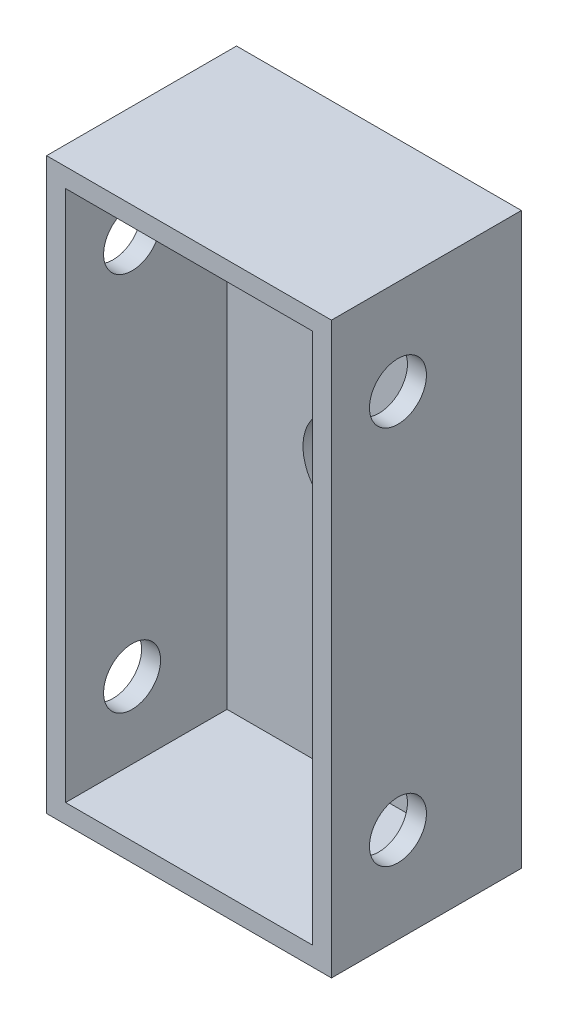
ISO-10303-21;
HEADER;
FILE_DESCRIPTION(('STEP AP214'),'2;1');
FILE_NAME('part.step','',(''),(''),'','','');
FILE_SCHEMA(('AUTOMOTIVE_DESIGN { 1 0 10303 214 1 1 1 1 }'));
ENDSEC;
DATA;
#1=APPLICATION_CONTEXT('core data for automotive mechanical design processes');
#2=APPLICATION_PROTOCOL_DEFINITION('international standard','automotive_design',2000,#1);
#3=PRODUCT_CONTEXT('',#1,'mechanical');
#4=PRODUCT('Part','Part','',(#3));
#5=PRODUCT_RELATED_PRODUCT_CATEGORY('part','',(#4));
#6=PRODUCT_DEFINITION_FORMATION('','',#4);
#7=PRODUCT_DEFINITION_CONTEXT('part definition',#1,'design');
#8=PRODUCT_DEFINITION('design','',#6,#7);
#9=PRODUCT_DEFINITION_SHAPE('','',#8);
#10=(LENGTH_UNIT() NAMED_UNIT(*) SI_UNIT(.MILLI.,.METRE.));
#11=(NAMED_UNIT(*) PLANE_ANGLE_UNIT() SI_UNIT($,.RADIAN.));
#12=(NAMED_UNIT(*) SI_UNIT($,.STERADIAN.) SOLID_ANGLE_UNIT());
#13=UNCERTAINTY_MEASURE_WITH_UNIT(LENGTH_MEASURE(1.E-05),#10,'distance_accuracy_value','');
#14=(GEOMETRIC_REPRESENTATION_CONTEXT(3) GLOBAL_UNCERTAINTY_ASSIGNED_CONTEXT((#13)) GLOBAL_UNIT_ASSIGNED_CONTEXT((#10,
#11,#12)) REPRESENTATION_CONTEXT('',''));
#15=CARTESIAN_POINT('',(0.,0.,0.));
#16=DIRECTION('',(0.,0.,1.));
#17=DIRECTION('',(1.,0.,0.));
#18=AXIS2_PLACEMENT_3D('',#15,#16,#17);
#19=CARTESIAN_POINT('',(0.,0.,20.));
#20=DIRECTION('',(1.,0.,0.));
#21=DIRECTION('',(0.,0.,-1.));
#22=AXIS2_PLACEMENT_3D('',#19,#20,#21);
#23=PLANE('',#22);
#24=CARTESIAN_POINT('',(0.,50.,13.));
#25=DIRECTION('',(1.,0.,0.));
#26=DIRECTION('',(0.,0.,-1.));
#27=AXIS2_PLACEMENT_3D('',#24,#25,#26);
#28=CIRCLE('',#27,3.);
#29=CARTESIAN_POINT('',(0.,50.,10.));
#30=VERTEX_POINT('',#29);
#31=EDGE_CURVE('E174',#30,#30,#28,.T.);
#32=ORIENTED_EDGE('',*,*,#31,.T.);
#33=EDGE_LOOP('',(#32));
#34=FACE_BOUND('',#33,.T.);
#35=CARTESIAN_POINT('',(0.,10.,13.));
#36=DIRECTION('',(1.,0.,0.));
#37=DIRECTION('',(0.,0.,-1.));
#38=AXIS2_PLACEMENT_3D('',#35,#36,#37);
#39=CIRCLE('',#38,3.);
#40=CARTESIAN_POINT('',(0.,10.,10.));
#41=VERTEX_POINT('',#40);
#42=EDGE_CURVE('E185',#41,#41,#39,.T.);
#43=ORIENTED_EDGE('',*,*,#42,.T.);
#44=EDGE_LOOP('',(#43));
#45=FACE_BOUND('',#44,.T.);
#46=DIRECTION('',(0.,-1.,0.));
#47=VECTOR('',#46,1.);
#48=CARTESIAN_POINT('',(0.,0.,0.));
#49=LINE('',#48,#47);
#50=CARTESIAN_POINT('',(0.,60.,0.));
#51=VERTEX_POINT('',#50);
#52=CARTESIAN_POINT('',(0.,0.,0.));
#53=VERTEX_POINT('',#52);
#54=EDGE_CURVE('E147',#51,#53,#49,.T.);
#55=ORIENTED_EDGE('',*,*,#54,.T.);
#56=DIRECTION('',(0.,0.,-1.));
#57=VECTOR('',#56,1.);
#58=CARTESIAN_POINT('',(0.,0.,20.));
#59=LINE('',#58,#57);
#60=CARTESIAN_POINT('',(0.,0.,20.));
#61=VERTEX_POINT('',#60);
#62=EDGE_CURVE('E11',#61,#53,#59,.T.);
#63=ORIENTED_EDGE('',*,*,#62,.F.);
#64=DIRECTION('',(0.,-1.,0.));
#65=VECTOR('',#64,1.);
#66=CARTESIAN_POINT('',(0.,0.,20.));
#67=LINE('',#66,#65);
#68=CARTESIAN_POINT('',(0.,60.,20.));
#69=VERTEX_POINT('',#68);
#70=EDGE_CURVE('E151',#69,#61,#67,.T.);
#71=ORIENTED_EDGE('',*,*,#70,.F.);
#72=DIRECTION('',(0.,0.,-1.));
#73=VECTOR('',#72,1.);
#74=CARTESIAN_POINT('',(0.,60.,20.));
#75=LINE('',#74,#73);
#76=EDGE_CURVE('E157',#69,#51,#75,.T.);
#77=ORIENTED_EDGE('',*,*,#76,.T.);
#78=EDGE_LOOP('',(#55,#63,#71,#77));
#79=FACE_BOUND('',#78,.T.);
#80=ADVANCED_FACE('F34',(#34,#45,#79),#23,.F.);
#81=CARTESIAN_POINT('',(0.,0.,20.));
#82=DIRECTION('',(0.,1.,0.));
#83=DIRECTION('',(0.,0.,1.));
#84=AXIS2_PLACEMENT_3D('',#81,#82,#83);
#85=PLANE('',#84);
#86=DIRECTION('',(1.,0.,0.));
#87=VECTOR('',#86,1.);
#88=CARTESIAN_POINT('',(0.,0.,0.));
#89=LINE('',#88,#87);
#90=CARTESIAN_POINT('',(30.,0.,0.));
#91=VERTEX_POINT('',#90);
#92=EDGE_CURVE('E160',#53,#91,#89,.T.);
#93=ORIENTED_EDGE('',*,*,#92,.T.);
#94=DIRECTION('',(0.,0.,-1.));
#95=VECTOR('',#94,1.);
#96=CARTESIAN_POINT('',(30.,0.,20.));
#97=LINE('',#96,#95);
#98=CARTESIAN_POINT('',(30.,0.,20.));
#99=VERTEX_POINT('',#98);
#100=EDGE_CURVE('E42',#99,#91,#97,.T.);
#101=ORIENTED_EDGE('',*,*,#100,.F.);
#102=DIRECTION('',(1.,0.,0.));
#103=VECTOR('',#102,1.);
#104=CARTESIAN_POINT('',(0.,0.,20.));
#105=LINE('',#104,#103);
#106=EDGE_CURVE('E87',#61,#99,#105,.T.);
#107=ORIENTED_EDGE('',*,*,#106,.F.);
#108=ORIENTED_EDGE('',*,*,#62,.T.);
#109=EDGE_LOOP('',(#93,#101,#107,#108));
#110=FACE_BOUND('',#109,.T.);
#111=ADVANCED_FACE('F232',(#110),#85,.F.);
#112=CARTESIAN_POINT('',(30.,0.,20.));
#113=DIRECTION('',(-1.,0.,0.));
#114=DIRECTION('',(0.,0.,1.));
#115=AXIS2_PLACEMENT_3D('',#112,#113,#114);
#116=PLANE('',#115);
#117=CARTESIAN_POINT('',(30.,50.,13.));
#118=DIRECTION('',(1.,0.,0.));
#119=DIRECTION('',(0.,0.,-1.));
#120=AXIS2_PLACEMENT_3D('',#117,#118,#119);
#121=CIRCLE('',#120,3.);
#122=CARTESIAN_POINT('',(30.,50.,10.));
#123=VERTEX_POINT('',#122);
#124=EDGE_CURVE('E180',#123,#123,#121,.T.);
#125=ORIENTED_EDGE('',*,*,#124,.F.);
#126=EDGE_LOOP('',(#125));
#127=FACE_BOUND('',#126,.T.);
#128=CARTESIAN_POINT('',(30.,10.,13.));
#129=DIRECTION('',(1.,0.,0.));
#130=DIRECTION('',(0.,0.,-1.));
#131=AXIS2_PLACEMENT_3D('',#128,#129,#130);
#132=CIRCLE('',#131,3.);
#133=CARTESIAN_POINT('',(30.,10.,10.));
#134=VERTEX_POINT('',#133);
#135=EDGE_CURVE('E190',#134,#134,#132,.T.);
#136=ORIENTED_EDGE('',*,*,#135,.F.);
#137=EDGE_LOOP('',(#136));
#138=FACE_BOUND('',#137,.T.);
#139=DIRECTION('',(0.,1.,0.));
#140=VECTOR('',#139,1.);
#141=CARTESIAN_POINT('',(30.,0.,0.));
#142=LINE('',#141,#140);
#143=CARTESIAN_POINT('',(30.,60.,0.));
#144=VERTEX_POINT('',#143);
#145=EDGE_CURVE('E162',#91,#144,#142,.T.);
#146=ORIENTED_EDGE('',*,*,#145,.T.);
#147=DIRECTION('',(0.,0.,-1.));
#148=VECTOR('',#147,1.);
#149=CARTESIAN_POINT('',(30.,60.,20.));
#150=LINE('',#149,#148);
#151=CARTESIAN_POINT('',(30.,60.,20.));
#152=VERTEX_POINT('',#151);
#153=EDGE_CURVE('E166',#152,#144,#150,.T.);
#154=ORIENTED_EDGE('',*,*,#153,.F.);
#155=DIRECTION('',(0.,1.,0.));
#156=VECTOR('',#155,1.);
#157=CARTESIAN_POINT('',(30.,0.,20.));
#158=LINE('',#157,#156);
#159=EDGE_CURVE('E154',#99,#152,#158,.T.);
#160=ORIENTED_EDGE('',*,*,#159,.F.);
#161=ORIENTED_EDGE('',*,*,#100,.T.);
#162=EDGE_LOOP('',(#146,#154,#160,#161));
#163=FACE_BOUND('',#162,.T.);
#164=ADVANCED_FACE('F231',(#127,#138,#163),#116,.F.);
#165=CARTESIAN_POINT('',(0.,60.,20.));
#166=DIRECTION('',(0.,-1.,0.));
#167=DIRECTION('',(0.,0.,-1.));
#168=AXIS2_PLACEMENT_3D('',#165,#166,#167);
#169=PLANE('',#168);
#170=DIRECTION('',(-1.,0.,0.));
#171=VECTOR('',#170,1.);
#172=CARTESIAN_POINT('',(0.,60.,0.));
#173=LINE('',#172,#171);
#174=EDGE_CURVE('E80',#144,#51,#173,.T.);
#175=ORIENTED_EDGE('',*,*,#174,.T.);
#176=ORIENTED_EDGE('',*,*,#76,.F.);
#177=DIRECTION('',(-1.,0.,0.));
#178=VECTOR('',#177,1.);
#179=CARTESIAN_POINT('',(0.,60.,20.));
#180=LINE('',#179,#178);
#181=EDGE_CURVE('E59',#152,#69,#180,.T.);
#182=ORIENTED_EDGE('',*,*,#181,.F.);
#183=ORIENTED_EDGE('',*,*,#153,.T.);
#184=EDGE_LOOP('',(#175,#176,#182,#183));
#185=FACE_BOUND('',#184,.T.);
#186=ADVANCED_FACE('F227',(#185),#169,.F.);
#187=CARTESIAN_POINT('',(0.,0.,20.));
#188=DIRECTION('',(0.,0.,-1.));
#189=DIRECTION('',(-1.,0.,0.));
#190=AXIS2_PLACEMENT_3D('',#187,#188,#189);
#191=PLANE('',#190);
#192=DIRECTION('',(1.,0.,0.));
#193=VECTOR('',#192,1.);
#194=CARTESIAN_POINT('',(0.,2.,20.));
#195=LINE('',#194,#193);
#196=CARTESIAN_POINT('',(2.,2.,20.));
#197=VERTEX_POINT('',#196);
#198=CARTESIAN_POINT('',(28.,2.,20.));
#199=VERTEX_POINT('',#198);
#200=EDGE_CURVE('E140',#197,#199,#195,.T.);
#201=ORIENTED_EDGE('',*,*,#200,.F.);
#202=DIRECTION('',(0.,-1.,0.));
#203=VECTOR('',#202,1.);
#204=CARTESIAN_POINT('',(2.,0.,20.));
#205=LINE('',#204,#203);
#206=CARTESIAN_POINT('',(1.99999999999999,58.,20.));
#207=VERTEX_POINT('',#206);
#208=EDGE_CURVE('E50',#207,#197,#205,.T.);
#209=ORIENTED_EDGE('',*,*,#208,.F.);
#210=DIRECTION('',(1.,0.,0.));
#211=VECTOR('',#210,1.);
#212=CARTESIAN_POINT('',(0.,58.,20.));
#213=LINE('',#212,#211);
#214=CARTESIAN_POINT('',(28.,58.,20.));
#215=VERTEX_POINT('',#214);
#216=EDGE_CURVE('E128',#207,#215,#213,.T.);
#217=ORIENTED_EDGE('',*,*,#216,.T.);
#218=DIRECTION('',(0.,-1.,0.));
#219=VECTOR('',#218,1.);
#220=CARTESIAN_POINT('',(28.,0.,20.));
#221=LINE('',#220,#219);
#222=EDGE_CURVE('E131',#215,#199,#221,.T.);
#223=ORIENTED_EDGE('',*,*,#222,.T.);
#224=EDGE_LOOP('',(#201,#209,#217,#223));
#225=FACE_BOUND('',#224,.T.);
#226=ORIENTED_EDGE('',*,*,#70,.T.);
#227=ORIENTED_EDGE('',*,*,#106,.T.);
#228=ORIENTED_EDGE('',*,*,#159,.T.);
#229=ORIENTED_EDGE('',*,*,#181,.T.);
#230=EDGE_LOOP('',(#226,#227,#228,#229));
#231=FACE_BOUND('',#230,.T.);
#232=ADVANCED_FACE('F217',(#225,#231),#191,.F.);
#233=CARTESIAN_POINT('',(0.,0.,0.));
#234=DIRECTION('',(0.,0.,-1.));
#235=DIRECTION('',(-1.,0.,0.));
#236=AXIS2_PLACEMENT_3D('',#233,#234,#235);
#237=PLANE('',#236);
#238=CARTESIAN_POINT('',(15.,10.,0.));
#239=DIRECTION('',(0.,0.,-1.));
#240=DIRECTION('',(-1.,0.,0.));
#241=AXIS2_PLACEMENT_3D('',#238,#239,#240);
#242=CIRCLE('',#241,3.);
#243=CARTESIAN_POINT('',(12.,10.,0.));
#244=VERTEX_POINT('',#243);
#245=EDGE_CURVE('E134',#244,#244,#242,.T.);
#246=ORIENTED_EDGE('',*,*,#245,.F.);
#247=EDGE_LOOP('',(#246));
#248=FACE_BOUND('',#247,.T.);
#249=CARTESIAN_POINT('',(15.,50.,0.));
#250=DIRECTION('',(0.,0.,-1.));
#251=DIRECTION('',(-1.,0.,0.));
#252=AXIS2_PLACEMENT_3D('',#249,#250,#251);
#253=CIRCLE('',#252,3.);
#254=CARTESIAN_POINT('',(12.,50.,0.));
#255=VERTEX_POINT('',#254);
#256=EDGE_CURVE('E200',#255,#255,#253,.T.);
#257=ORIENTED_EDGE('',*,*,#256,.F.);
#258=EDGE_LOOP('',(#257));
#259=FACE_BOUND('',#258,.T.);
#260=CARTESIAN_POINT('',(15.,30.,0.));
#261=DIRECTION('',(0.,0.,-1.));
#262=DIRECTION('',(-1.,0.,0.));
#263=AXIS2_PLACEMENT_3D('',#260,#261,#262);
#264=CIRCLE('',#263,5.);
#265=CARTESIAN_POINT('',(10.,30.,0.));
#266=VERTEX_POINT('',#265);
#267=EDGE_CURVE('E141',#266,#266,#264,.T.);
#268=ORIENTED_EDGE('',*,*,#267,.F.);
#269=EDGE_LOOP('',(#268));
#270=FACE_BOUND('',#269,.T.);
#271=ORIENTED_EDGE('',*,*,#54,.F.);
#272=ORIENTED_EDGE('',*,*,#174,.F.);
#273=ORIENTED_EDGE('',*,*,#145,.F.);
#274=ORIENTED_EDGE('',*,*,#92,.F.);
#275=EDGE_LOOP('',(#271,#272,#273,#274));
#276=FACE_BOUND('',#275,.T.);
#277=ADVANCED_FACE('F214',(#248,#259,#270,#276),#237,.T.);
#278=CARTESIAN_POINT('',(2.,0.,3.));
#279=DIRECTION('',(-1.,0.,0.));
#280=DIRECTION('',(0.,-1.,0.));
#281=AXIS2_PLACEMENT_3D('',#278,#279,#280);
#282=PLANE('',#281);
#283=CARTESIAN_POINT('',(1.99999999999999,50.,13.));
#284=DIRECTION('',(-1.,0.,0.));
#285=DIRECTION('',(0.,-1.,0.));
#286=AXIS2_PLACEMENT_3D('',#283,#284,#285);
#287=CIRCLE('',#286,3.);
#288=CARTESIAN_POINT('',(1.99999999999999,47.,13.));
#289=VERTEX_POINT('',#288);
#290=EDGE_CURVE('E193',#289,#289,#287,.T.);
#291=ORIENTED_EDGE('',*,*,#290,.T.);
#292=EDGE_LOOP('',(#291));
#293=FACE_BOUND('',#292,.T.);
#294=CARTESIAN_POINT('',(2.,10.,13.));
#295=DIRECTION('',(-1.,0.,0.));
#296=DIRECTION('',(0.,-1.,0.));
#297=AXIS2_PLACEMENT_3D('',#294,#295,#296);
#298=CIRCLE('',#297,3.);
#299=CARTESIAN_POINT('',(2.,7.,13.));
#300=VERTEX_POINT('',#299);
#301=EDGE_CURVE('E173',#300,#300,#298,.T.);
#302=ORIENTED_EDGE('',*,*,#301,.T.);
#303=EDGE_LOOP('',(#302));
#304=FACE_BOUND('',#303,.T.);
#305=ORIENTED_EDGE('',*,*,#208,.T.);
#306=DIRECTION('',(0.,0.,1.));
#307=VECTOR('',#306,1.);
#308=CARTESIAN_POINT('',(2.,2.,3.));
#309=LINE('',#308,#307);
#310=CARTESIAN_POINT('',(2.,2.,3.));
#311=VERTEX_POINT('',#310);
#312=EDGE_CURVE('E107',#311,#197,#309,.T.);
#313=ORIENTED_EDGE('',*,*,#312,.F.);
#314=DIRECTION('',(0.,-1.,0.));
#315=VECTOR('',#314,1.);
#316=CARTESIAN_POINT('',(2.,0.,3.));
#317=LINE('',#316,#315);
#318=CARTESIAN_POINT('',(1.99999999999999,58.,3.));
#319=VERTEX_POINT('',#318);
#320=EDGE_CURVE('E111',#319,#311,#317,.T.);
#321=ORIENTED_EDGE('',*,*,#320,.F.);
#322=DIRECTION('',(0.,0.,1.));
#323=VECTOR('',#322,1.);
#324=CARTESIAN_POINT('',(1.99999999999999,58.,3.));
#325=LINE('',#324,#323);
#326=EDGE_CURVE('E145',#319,#207,#325,.T.);
#327=ORIENTED_EDGE('',*,*,#326,.T.);
#328=EDGE_LOOP('',(#305,#313,#321,#327));
#329=FACE_BOUND('',#328,.T.);
#330=ADVANCED_FACE('F109',(#293,#304,#329),#282,.F.);
#331=CARTESIAN_POINT('',(0.,58.,3.));
#332=DIRECTION('',(0.,-1.,0.));
#333=DIRECTION('',(0.,0.,-1.));
#334=AXIS2_PLACEMENT_3D('',#331,#332,#333);
#335=PLANE('',#334);
#336=ORIENTED_EDGE('',*,*,#216,.F.);
#337=ORIENTED_EDGE('',*,*,#326,.F.);
#338=DIRECTION('',(1.,0.,0.));
#339=VECTOR('',#338,1.);
#340=CARTESIAN_POINT('',(0.,58.,3.));
#341=LINE('',#340,#339);
#342=CARTESIAN_POINT('',(28.,58.,3.));
#343=VERTEX_POINT('',#342);
#344=EDGE_CURVE('E116',#319,#343,#341,.T.);
#345=ORIENTED_EDGE('',*,*,#344,.T.);
#346=DIRECTION('',(0.,0.,1.));
#347=VECTOR('',#346,1.);
#348=CARTESIAN_POINT('',(28.,58.,3.));
#349=LINE('',#348,#347);
#350=EDGE_CURVE('E148',#343,#215,#349,.T.);
#351=ORIENTED_EDGE('',*,*,#350,.T.);
#352=EDGE_LOOP('',(#336,#337,#345,#351));
#353=FACE_BOUND('',#352,.T.);
#354=ADVANCED_FACE('F248',(#353),#335,.T.);
#355=CARTESIAN_POINT('',(28.,0.,3.));
#356=DIRECTION('',(-1.,0.,0.));
#357=DIRECTION('',(0.,-1.,0.));
#358=AXIS2_PLACEMENT_3D('',#355,#356,#357);
#359=PLANE('',#358);
#360=CARTESIAN_POINT('',(28.,50.,13.));
#361=DIRECTION('',(-1.,0.,0.));
#362=DIRECTION('',(0.,-1.,0.));
#363=AXIS2_PLACEMENT_3D('',#360,#361,#362);
#364=CIRCLE('',#363,3.);
#365=CARTESIAN_POINT('',(28.,47.,13.));
#366=VERTEX_POINT('',#365);
#367=EDGE_CURVE('E37',#366,#366,#364,.T.);
#368=ORIENTED_EDGE('',*,*,#367,.F.);
#369=EDGE_LOOP('',(#368));
#370=FACE_BOUND('',#369,.T.);
#371=CARTESIAN_POINT('',(28.,10.,13.));
#372=DIRECTION('',(-1.,0.,0.));
#373=DIRECTION('',(0.,-1.,0.));
#374=AXIS2_PLACEMENT_3D('',#371,#372,#373);
#375=CIRCLE('',#374,3.);
#376=CARTESIAN_POINT('',(28.,7.,13.));
#377=VERTEX_POINT('',#376);
#378=EDGE_CURVE('E171',#377,#377,#375,.T.);
#379=ORIENTED_EDGE('',*,*,#378,.F.);
#380=EDGE_LOOP('',(#379));
#381=FACE_BOUND('',#380,.T.);
#382=ORIENTED_EDGE('',*,*,#222,.F.);
#383=ORIENTED_EDGE('',*,*,#350,.F.);
#384=DIRECTION('',(0.,-1.,0.));
#385=VECTOR('',#384,1.);
#386=CARTESIAN_POINT('',(28.,0.,3.));
#387=LINE('',#386,#385);
#388=CARTESIAN_POINT('',(28.,2.,3.));
#389=VERTEX_POINT('',#388);
#390=EDGE_CURVE('E124',#343,#389,#387,.T.);
#391=ORIENTED_EDGE('',*,*,#390,.T.);
#392=DIRECTION('',(0.,0.,1.));
#393=VECTOR('',#392,1.);
#394=CARTESIAN_POINT('',(28.,2.,3.));
#395=LINE('',#394,#393);
#396=EDGE_CURVE('E115',#389,#199,#395,.T.);
#397=ORIENTED_EDGE('',*,*,#396,.T.);
#398=EDGE_LOOP('',(#382,#383,#391,#397));
#399=FACE_BOUND('',#398,.T.);
#400=ADVANCED_FACE('F252',(#370,#381,#399),#359,.T.);
#401=CARTESIAN_POINT('',(0.,2.,3.));
#402=DIRECTION('',(0.,-1.,0.));
#403=DIRECTION('',(0.,0.,-1.));
#404=AXIS2_PLACEMENT_3D('',#401,#402,#403);
#405=PLANE('',#404);
#406=ORIENTED_EDGE('',*,*,#200,.T.);
#407=ORIENTED_EDGE('',*,*,#396,.F.);
#408=DIRECTION('',(1.,0.,0.));
#409=VECTOR('',#408,1.);
#410=CARTESIAN_POINT('',(0.,2.,3.));
#411=LINE('',#410,#409);
#412=EDGE_CURVE('E120',#311,#389,#411,.T.);
#413=ORIENTED_EDGE('',*,*,#412,.F.);
#414=ORIENTED_EDGE('',*,*,#312,.T.);
#415=EDGE_LOOP('',(#406,#407,#413,#414));
#416=FACE_BOUND('',#415,.T.);
#417=ADVANCED_FACE('F121',(#416),#405,.F.);
#418=CARTESIAN_POINT('',(0.,0.,3.));
#419=DIRECTION('',(0.,0.,1.));
#420=DIRECTION('',(1.,0.,0.));
#421=AXIS2_PLACEMENT_3D('',#418,#419,#420);
#422=PLANE('',#421);
#423=CARTESIAN_POINT('',(15.,30.,3.));
#424=DIRECTION('',(0.,0.,1.));
#425=DIRECTION('',(1.,0.,0.));
#426=AXIS2_PLACEMENT_3D('',#423,#424,#425);
#427=CIRCLE('',#426,5.);
#428=CARTESIAN_POINT('',(20.,30.,3.));
#429=VERTEX_POINT('',#428);
#430=EDGE_CURVE('E196',#429,#429,#427,.T.);
#431=ORIENTED_EDGE('',*,*,#430,.F.);
#432=EDGE_LOOP('',(#431));
#433=FACE_BOUND('',#432,.T.);
#434=CARTESIAN_POINT('',(15.,10.,3.));
#435=DIRECTION('',(0.,0.,1.));
#436=DIRECTION('',(1.,0.,0.));
#437=AXIS2_PLACEMENT_3D('',#434,#435,#436);
#438=CIRCLE('',#437,3.);
#439=CARTESIAN_POINT('',(18.,10.,3.));
#440=VERTEX_POINT('',#439);
#441=EDGE_CURVE('E197',#440,#440,#438,.T.);
#442=ORIENTED_EDGE('',*,*,#441,.F.);
#443=EDGE_LOOP('',(#442));
#444=FACE_BOUND('',#443,.T.);
#445=CARTESIAN_POINT('',(15.,50.,3.));
#446=DIRECTION('',(0.,0.,1.));
#447=DIRECTION('',(1.,0.,0.));
#448=AXIS2_PLACEMENT_3D('',#445,#446,#447);
#449=CIRCLE('',#448,3.);
#450=CARTESIAN_POINT('',(18.,50.,3.));
#451=VERTEX_POINT('',#450);
#452=EDGE_CURVE('E201',#451,#451,#449,.T.);
#453=ORIENTED_EDGE('',*,*,#452,.F.);
#454=EDGE_LOOP('',(#453));
#455=FACE_BOUND('',#454,.T.);
#456=ORIENTED_EDGE('',*,*,#320,.T.);
#457=ORIENTED_EDGE('',*,*,#412,.T.);
#458=ORIENTED_EDGE('',*,*,#390,.F.);
#459=ORIENTED_EDGE('',*,*,#344,.F.);
#460=EDGE_LOOP('',(#456,#457,#458,#459));
#461=FACE_BOUND('',#460,.T.);
#462=ADVANCED_FACE('F127',(#433,#444,#455,#461),#422,.T.);
#463=CARTESIAN_POINT('',(15.,50.,-14.));
#464=DIRECTION('',(0.,0.,1.));
#465=DIRECTION('',(1.,0.,0.));
#466=AXIS2_PLACEMENT_3D('',#463,#464,#465);
#467=CYLINDRICAL_SURFACE('',#466,3.);
#468=ORIENTED_EDGE('',*,*,#256,.T.);
#469=EDGE_LOOP('',(#468));
#470=FACE_BOUND('',#469,.T.);
#471=ORIENTED_EDGE('',*,*,#452,.T.);
#472=EDGE_LOOP('',(#471));
#473=FACE_BOUND('',#472,.T.);
#474=ADVANCED_FACE('F261',(#470,#473),#467,.F.);
#475=CARTESIAN_POINT('',(15.,10.,-14.));
#476=DIRECTION('',(0.,0.,1.));
#477=DIRECTION('',(1.,0.,0.));
#478=AXIS2_PLACEMENT_3D('',#475,#476,#477);
#479=CYLINDRICAL_SURFACE('',#478,3.);
#480=ORIENTED_EDGE('',*,*,#245,.T.);
#481=EDGE_LOOP('',(#480));
#482=FACE_BOUND('',#481,.T.);
#483=ORIENTED_EDGE('',*,*,#441,.T.);
#484=EDGE_LOOP('',(#483));
#485=FACE_BOUND('',#484,.T.);
#486=ADVANCED_FACE('F211',(#482,#485),#479,.F.);
#487=CARTESIAN_POINT('',(15.,30.,-14.));
#488=DIRECTION('',(0.,0.,1.));
#489=DIRECTION('',(1.,0.,0.));
#490=AXIS2_PLACEMENT_3D('',#487,#488,#489);
#491=CYLINDRICAL_SURFACE('',#490,5.);
#492=ORIENTED_EDGE('',*,*,#267,.T.);
#493=EDGE_LOOP('',(#492));
#494=FACE_BOUND('',#493,.T.);
#495=ORIENTED_EDGE('',*,*,#430,.T.);
#496=EDGE_LOOP('',(#495));
#497=FACE_BOUND('',#496,.T.);
#498=ADVANCED_FACE('F263',(#494,#497),#491,.F.);
#499=CARTESIAN_POINT('',(0.,10.,13.));
#500=DIRECTION('',(1.,0.,0.));
#501=DIRECTION('',(0.,0.,-1.));
#502=AXIS2_PLACEMENT_3D('',#499,#500,#501);
#503=CYLINDRICAL_SURFACE('',#502,3.);
#504=ORIENTED_EDGE('',*,*,#378,.T.);
#505=EDGE_LOOP('',(#504));
#506=FACE_BOUND('',#505,.T.);
#507=ORIENTED_EDGE('',*,*,#135,.T.);
#508=EDGE_LOOP('',(#507));
#509=FACE_BOUND('',#508,.T.);
#510=ADVANCED_FACE('F266',(#506,#509),#503,.F.);
#511=CARTESIAN_POINT('',(0.,50.,13.));
#512=DIRECTION('',(1.,0.,0.));
#513=DIRECTION('',(0.,0.,-1.));
#514=AXIS2_PLACEMENT_3D('',#511,#512,#513);
#515=CYLINDRICAL_SURFACE('',#514,3.);
#516=ORIENTED_EDGE('',*,*,#367,.T.);
#517=EDGE_LOOP('',(#516));
#518=FACE_BOUND('',#517,.T.);
#519=ORIENTED_EDGE('',*,*,#124,.T.);
#520=EDGE_LOOP('',(#519));
#521=FACE_BOUND('',#520,.T.);
#522=ADVANCED_FACE('F274',(#518,#521),#515,.F.);
#523=ORIENTED_EDGE('',*,*,#42,.F.);
#524=EDGE_LOOP('',(#523));
#525=FACE_BOUND('',#524,.T.);
#526=ORIENTED_EDGE('',*,*,#301,.F.);
#527=EDGE_LOOP('',(#526));
#528=FACE_BOUND('',#527,.T.);
#529=ADVANCED_FACE('F275',(#525,#528),#503,.F.);
#530=ORIENTED_EDGE('',*,*,#31,.F.);
#531=EDGE_LOOP('',(#530));
#532=FACE_BOUND('',#531,.T.);
#533=ORIENTED_EDGE('',*,*,#290,.F.);
#534=EDGE_LOOP('',(#533));
#535=FACE_BOUND('',#534,.T.);
#536=ADVANCED_FACE('F278',(#532,#535),#515,.F.);
#537=CLOSED_SHELL('',(#80,#111,#164,#186,#232,#277,#330,#354,#400,#417,#462,#474,#486,#498,#510,
#522,#529,#536));
#538=MANIFOLD_SOLID_BREP('B2',#537);
#539=ADVANCED_BREP_SHAPE_REPRESENTATION('',(#18,#538),#14);
#540=SHAPE_DEFINITION_REPRESENTATION(#9,#539);
ENDSEC;
END-ISO-10303-21;
